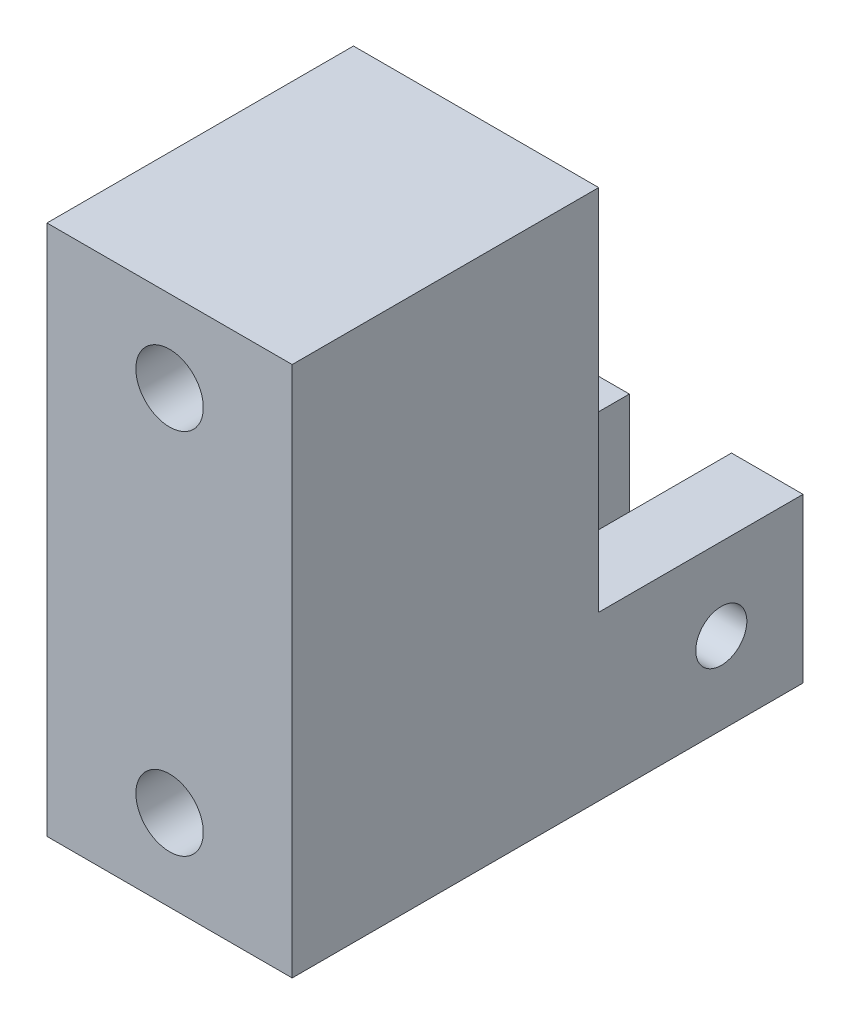
ISO-10303-21;
HEADER;
FILE_DESCRIPTION(('STEP AP214'),'2;1');
FILE_NAME('part.step','',(''),(''),'','','');
FILE_SCHEMA(('AUTOMOTIVE_DESIGN { 1 0 10303 214 1 1 1 1 }'));
ENDSEC;
DATA;
#1=APPLICATION_CONTEXT('core data for automotive mechanical design processes');
#2=APPLICATION_PROTOCOL_DEFINITION('international standard','automotive_design',2000,#1);
#3=PRODUCT_CONTEXT('',#1,'mechanical');
#4=PRODUCT('Part','Part','',(#3));
#5=PRODUCT_RELATED_PRODUCT_CATEGORY('part','',(#4));
#6=PRODUCT_DEFINITION_FORMATION('','',#4);
#7=PRODUCT_DEFINITION_CONTEXT('part definition',#1,'design');
#8=PRODUCT_DEFINITION('design','',#6,#7);
#9=PRODUCT_DEFINITION_SHAPE('','',#8);
#10=(LENGTH_UNIT() NAMED_UNIT(*) SI_UNIT(.MILLI.,.METRE.));
#11=(NAMED_UNIT(*) PLANE_ANGLE_UNIT() SI_UNIT($,.RADIAN.));
#12=(NAMED_UNIT(*) SI_UNIT($,.STERADIAN.) SOLID_ANGLE_UNIT());
#13=UNCERTAINTY_MEASURE_WITH_UNIT(LENGTH_MEASURE(1.E-05),#10,'distance_accuracy_value','');
#14=(GEOMETRIC_REPRESENTATION_CONTEXT(3) GLOBAL_UNCERTAINTY_ASSIGNED_CONTEXT((#13)) GLOBAL_UNIT_ASSIGNED_CONTEXT((#10,
#11,#12)) REPRESENTATION_CONTEXT('',''));
#15=CARTESIAN_POINT('',(0.,0.,0.));
#16=DIRECTION('',(0.,0.,1.));
#17=DIRECTION('',(1.,0.,0.));
#18=AXIS2_PLACEMENT_3D('',#15,#16,#17);
#19=CARTESIAN_POINT('',(6.,0.,0.));
#20=DIRECTION('',(-1.,0.,0.));
#21=DIRECTION('',(0.,0.,-1.));
#22=AXIS2_PLACEMENT_3D('',#19,#20,#21);
#23=PLANE('',#22);
#24=DIRECTION('',(0.,1.,0.));
#25=VECTOR('',#24,1.);
#26=CARTESIAN_POINT('',(6.,-13.,7.5));
#27=LINE('',#26,#25);
#28=CARTESIAN_POINT('',(6.,-13.,7.5));
#29=VERTEX_POINT('',#28);
#30=CARTESIAN_POINT('',(6.,13.,7.5));
#31=VERTEX_POINT('',#30);
#32=EDGE_CURVE('E158',#29,#31,#27,.T.);
#33=ORIENTED_EDGE('',*,*,#32,.F.);
#34=DIRECTION('',(0.,0.,1.));
#35=VECTOR('',#34,1.);
#36=CARTESIAN_POINT('',(6.,-13.,-7.5));
#37=LINE('',#36,#35);
#38=CARTESIAN_POINT('',(6.,-13.,-17.5));
#39=VERTEX_POINT('',#38);
#40=EDGE_CURVE('E138',#39,#29,#37,.T.);
#41=ORIENTED_EDGE('',*,*,#40,.F.);
#42=DIRECTION('',(0.,-1.,0.));
#43=VECTOR('',#42,1.);
#44=CARTESIAN_POINT('',(6.,-13.,-17.5));
#45=LINE('',#44,#43);
#46=CARTESIAN_POINT('',(6.,-5.,-17.5));
#47=VERTEX_POINT('',#46);
#48=EDGE_CURVE('E115',#47,#39,#45,.T.);
#49=ORIENTED_EDGE('',*,*,#48,.F.);
#50=DIRECTION('',(0.,0.,-1.));
#51=VECTOR('',#50,1.);
#52=CARTESIAN_POINT('',(6.,-5.,-7.5));
#53=LINE('',#52,#51);
#54=CARTESIAN_POINT('',(6.,-5.,-7.5));
#55=VERTEX_POINT('',#54);
#56=EDGE_CURVE('E127',#55,#47,#53,.T.);
#57=ORIENTED_EDGE('',*,*,#56,.F.);
#58=DIRECTION('',(0.,-1.,0.));
#59=VECTOR('',#58,1.);
#60=CARTESIAN_POINT('',(6.,-5.,-7.5));
#61=LINE('',#60,#59);
#62=CARTESIAN_POINT('',(6.,13.,-7.5));
#63=VERTEX_POINT('',#62);
#64=EDGE_CURVE('E134',#63,#55,#61,.T.);
#65=ORIENTED_EDGE('',*,*,#64,.F.);
#66=DIRECTION('',(0.,0.,-1.));
#67=VECTOR('',#66,1.);
#68=CARTESIAN_POINT('',(6.,13.,-7.5));
#69=LINE('',#68,#67);
#70=EDGE_CURVE('E165',#31,#63,#69,.T.);
#71=ORIENTED_EDGE('',*,*,#70,.F.);
#72=EDGE_LOOP('',(#33,#41,#49,#57,#65,#71));
#73=FACE_BOUND('',#72,.T.);
#74=CARTESIAN_POINT('',(6.,-9.,-13.5));
#75=DIRECTION('',(-1.,0.,0.));
#76=DIRECTION('',(0.,0.,1.));
#77=AXIS2_PLACEMENT_3D('',#74,#75,#76);
#78=CIRCLE('',#77,1.24999999999999);
#79=CARTESIAN_POINT('',(6.,-9.,-12.25));
#80=VERTEX_POINT('',#79);
#81=EDGE_CURVE('E218',#80,#80,#78,.T.);
#82=ORIENTED_EDGE('',*,*,#81,.T.);
#83=EDGE_LOOP('',(#82));
#84=FACE_BOUND('',#83,.T.);
#85=ADVANCED_FACE('F39',(#73,#84),#23,.F.);
#86=CARTESIAN_POINT('',(6.,-5.,-7.5));
#87=DIRECTION('',(0.,-1.,0.));
#88=DIRECTION('',(0.,0.,1.));
#89=AXIS2_PLACEMENT_3D('',#86,#87,#88);
#90=PLANE('',#89);
#91=DIRECTION('',(-1.,0.,0.));
#92=VECTOR('',#91,1.);
#93=CARTESIAN_POINT('',(6.,-5.,-7.5));
#94=LINE('',#93,#92);
#95=CARTESIAN_POINT('',(2.5,-5.,-7.5));
#96=VERTEX_POINT('',#95);
#97=EDGE_CURVE('E130',#55,#96,#94,.T.);
#98=ORIENTED_EDGE('',*,*,#97,.F.);
#99=ORIENTED_EDGE('',*,*,#56,.T.);
#100=DIRECTION('',(-1.,0.,0.));
#101=VECTOR('',#100,1.);
#102=CARTESIAN_POINT('',(6.,-5.,-17.5));
#103=LINE('',#102,#101);
#104=CARTESIAN_POINT('',(2.5,-5.,-17.5));
#105=VERTEX_POINT('',#104);
#106=EDGE_CURVE('E110',#47,#105,#103,.T.);
#107=ORIENTED_EDGE('',*,*,#106,.T.);
#108=DIRECTION('',(0.,0.,1.));
#109=VECTOR('',#108,1.);
#110=CARTESIAN_POINT('',(2.5,-5.,-17.5));
#111=LINE('',#110,#109);
#112=EDGE_CURVE('E196',#105,#96,#111,.T.);
#113=ORIENTED_EDGE('',*,*,#112,.T.);
#114=EDGE_LOOP('',(#98,#99,#107,#113));
#115=FACE_BOUND('',#114,.T.);
#116=ADVANCED_FACE('F128',(#115),#90,.F.);
#117=CARTESIAN_POINT('',(6.,-13.,-17.5));
#118=DIRECTION('',(0.,0.,1.));
#119=DIRECTION('',(0.,1.,0.));
#120=AXIS2_PLACEMENT_3D('',#117,#118,#119);
#121=PLANE('',#120);
#122=ORIENTED_EDGE('',*,*,#106,.F.);
#123=ORIENTED_EDGE('',*,*,#48,.T.);
#124=DIRECTION('',(-1.,0.,0.));
#125=VECTOR('',#124,1.);
#126=CARTESIAN_POINT('',(6.,-13.,-17.5));
#127=LINE('',#126,#125);
#128=CARTESIAN_POINT('',(2.5,-13.,-17.5));
#129=VERTEX_POINT('',#128);
#130=EDGE_CURVE('E161',#39,#129,#127,.T.);
#131=ORIENTED_EDGE('',*,*,#130,.T.);
#132=DIRECTION('',(0.,1.,0.));
#133=VECTOR('',#132,1.);
#134=CARTESIAN_POINT('',(2.5,-13.001,-17.5));
#135=LINE('',#134,#133);
#136=EDGE_CURVE('E119',#129,#105,#135,.T.);
#137=ORIENTED_EDGE('',*,*,#136,.T.);
#138=EDGE_LOOP('',(#122,#123,#131,#137));
#139=FACE_BOUND('',#138,.T.);
#140=ADVANCED_FACE('F112',(#139),#121,.F.);
#141=CARTESIAN_POINT('',(6.,-13.,7.5));
#142=DIRECTION('',(0.,0.,-1.));
#143=DIRECTION('',(1.,0.,0.));
#144=AXIS2_PLACEMENT_3D('',#141,#142,#143);
#145=PLANE('',#144);
#146=CARTESIAN_POINT('',(0.,9.,7.5));
#147=DIRECTION('',(0.,0.,-1.));
#148=DIRECTION('',(-1.,0.,0.));
#149=AXIS2_PLACEMENT_3D('',#146,#147,#148);
#150=CIRCLE('',#149,1.65);
#151=CARTESIAN_POINT('',(-1.65,9.,7.5));
#152=VERTEX_POINT('',#151);
#153=EDGE_CURVE('E236',#152,#152,#150,.T.);
#154=ORIENTED_EDGE('',*,*,#153,.T.);
#155=EDGE_LOOP('',(#154));
#156=FACE_BOUND('',#155,.T.);
#157=CARTESIAN_POINT('',(0.,-9.,7.5));
#158=DIRECTION('',(0.,0.,-1.));
#159=DIRECTION('',(-1.,0.,0.));
#160=AXIS2_PLACEMENT_3D('',#157,#158,#159);
#161=CIRCLE('',#160,1.65);
#162=CARTESIAN_POINT('',(-1.65,-9.,7.5));
#163=VERTEX_POINT('',#162);
#164=EDGE_CURVE('E230',#163,#163,#161,.T.);
#165=ORIENTED_EDGE('',*,*,#164,.T.);
#166=EDGE_LOOP('',(#165));
#167=FACE_BOUND('',#166,.T.);
#168=DIRECTION('',(0.,1.,0.));
#169=VECTOR('',#168,1.);
#170=CARTESIAN_POINT('',(-6.,-13.,7.5));
#171=LINE('',#170,#169);
#172=CARTESIAN_POINT('',(-6.,-13.,7.5));
#173=VERTEX_POINT('',#172);
#174=CARTESIAN_POINT('',(-6.,13.,7.5));
#175=VERTEX_POINT('',#174);
#176=EDGE_CURVE('E143',#173,#175,#171,.T.);
#177=ORIENTED_EDGE('',*,*,#176,.F.);
#178=DIRECTION('',(-1.,0.,0.));
#179=VECTOR('',#178,1.);
#180=CARTESIAN_POINT('',(6.,-13.,7.5));
#181=LINE('',#180,#179);
#182=EDGE_CURVE('E63',#29,#173,#181,.T.);
#183=ORIENTED_EDGE('',*,*,#182,.F.);
#184=ORIENTED_EDGE('',*,*,#32,.T.);
#185=DIRECTION('',(-1.,0.,0.));
#186=VECTOR('',#185,1.);
#187=CARTESIAN_POINT('',(6.,13.,7.5));
#188=LINE('',#187,#186);
#189=EDGE_CURVE('E11',#31,#175,#188,.T.);
#190=ORIENTED_EDGE('',*,*,#189,.T.);
#191=EDGE_LOOP('',(#177,#183,#184,#190));
#192=FACE_BOUND('',#191,.T.);
#193=ADVANCED_FACE('F41',(#156,#167,#192),#145,.F.);
#194=CARTESIAN_POINT('',(6.,13.,-7.5));
#195=DIRECTION('',(0.,-1.,0.));
#196=DIRECTION('',(0.,0.,1.));
#197=AXIS2_PLACEMENT_3D('',#194,#195,#196);
#198=PLANE('',#197);
#199=DIRECTION('',(0.,0.,-1.));
#200=VECTOR('',#199,1.);
#201=CARTESIAN_POINT('',(-6.,13.,-7.5));
#202=LINE('',#201,#200);
#203=CARTESIAN_POINT('',(-6.,13.,-7.5));
#204=VERTEX_POINT('',#203);
#205=EDGE_CURVE('E145',#175,#204,#202,.T.);
#206=ORIENTED_EDGE('',*,*,#205,.F.);
#207=ORIENTED_EDGE('',*,*,#189,.F.);
#208=ORIENTED_EDGE('',*,*,#70,.T.);
#209=DIRECTION('',(-1.,0.,0.));
#210=VECTOR('',#209,1.);
#211=CARTESIAN_POINT('',(6.,13.,-7.5));
#212=LINE('',#211,#210);
#213=EDGE_CURVE('E47',#63,#204,#212,.T.);
#214=ORIENTED_EDGE('',*,*,#213,.T.);
#215=EDGE_LOOP('',(#206,#207,#208,#214));
#216=FACE_BOUND('',#215,.T.);
#217=ADVANCED_FACE('F164',(#216),#198,.F.);
#218=CARTESIAN_POINT('',(6.,-5.,-7.5));
#219=DIRECTION('',(0.,0.,1.));
#220=DIRECTION('',(-1.,0.,0.));
#221=AXIS2_PLACEMENT_3D('',#218,#219,#220);
#222=PLANE('',#221);
#223=CARTESIAN_POINT('',(0.,9.,-7.5));
#224=DIRECTION('',(0.,0.,-1.));
#225=DIRECTION('',(-1.,0.,0.));
#226=AXIS2_PLACEMENT_3D('',#223,#224,#225);
#227=CIRCLE('',#226,1.65);
#228=CARTESIAN_POINT('',(-1.65,9.,-7.5));
#229=VERTEX_POINT('',#228);
#230=EDGE_CURVE('E233',#229,#229,#227,.T.);
#231=ORIENTED_EDGE('',*,*,#230,.F.);
#232=EDGE_LOOP('',(#231));
#233=FACE_BOUND('',#232,.T.);
#234=CARTESIAN_POINT('',(0.,-9.,-7.5));
#235=DIRECTION('',(0.,0.,-1.));
#236=DIRECTION('',(-1.,0.,0.));
#237=AXIS2_PLACEMENT_3D('',#234,#235,#236);
#238=CIRCLE('',#237,1.65);
#239=CARTESIAN_POINT('',(-1.65,-9.,-7.5));
#240=VERTEX_POINT('',#239);
#241=EDGE_CURVE('E227',#240,#240,#238,.T.);
#242=ORIENTED_EDGE('',*,*,#241,.F.);
#243=EDGE_LOOP('',(#242));
#244=FACE_BOUND('',#243,.T.);
#245=DIRECTION('',(0.,-1.,0.));
#246=VECTOR('',#245,1.);
#247=CARTESIAN_POINT('',(-6.,-5.,-7.5));
#248=LINE('',#247,#246);
#249=CARTESIAN_POINT('',(-6.,-5.,-7.5));
#250=VERTEX_POINT('',#249);
#251=EDGE_CURVE('E149',#204,#250,#248,.T.);
#252=ORIENTED_EDGE('',*,*,#251,.F.);
#253=ORIENTED_EDGE('',*,*,#213,.F.);
#254=ORIENTED_EDGE('',*,*,#64,.T.);
#255=ORIENTED_EDGE('',*,*,#97,.T.);
#256=DIRECTION('',(0.,1.,0.));
#257=VECTOR('',#256,1.);
#258=CARTESIAN_POINT('',(2.5,-13.001,-7.49999999999999));
#259=LINE('',#258,#257);
#260=CARTESIAN_POINT('',(2.5,-13.,-7.49999999999999));
#261=VERTEX_POINT('',#260);
#262=EDGE_CURVE('E178',#261,#96,#259,.T.);
#263=ORIENTED_EDGE('',*,*,#262,.F.);
#264=DIRECTION('',(1.,0.,0.));
#265=VECTOR('',#264,1.);
#266=CARTESIAN_POINT('',(-2.5,-13.,-7.49999999999999));
#267=LINE('',#266,#265);
#268=CARTESIAN_POINT('',(-2.5,-13.,-7.49999999999999));
#269=VERTEX_POINT('',#268);
#270=EDGE_CURVE('E146',#269,#261,#267,.T.);
#271=ORIENTED_EDGE('',*,*,#270,.F.);
#272=DIRECTION('',(0.,1.,0.));
#273=VECTOR('',#272,1.);
#274=CARTESIAN_POINT('',(-2.5,-13.001,-7.49999999999999));
#275=LINE('',#274,#273);
#276=CARTESIAN_POINT('',(-2.5,-5.,-7.5));
#277=VERTEX_POINT('',#276);
#278=EDGE_CURVE('E201',#269,#277,#275,.T.);
#279=ORIENTED_EDGE('',*,*,#278,.T.);
#280=EDGE_CURVE('E123',#277,#250,#94,.T.);
#281=ORIENTED_EDGE('',*,*,#280,.T.);
#282=EDGE_LOOP('',(#252,#253,#254,#255,#263,#271,#279,#281));
#283=FACE_BOUND('',#282,.T.);
#284=ADVANCED_FACE('F172',(#233,#244,#283),#222,.F.);
#285=CARTESIAN_POINT('',(-2.5,-5.,-17.5));
#286=VERTEX_POINT('',#285);
#287=CARTESIAN_POINT('',(-6.,-5.,-17.5));
#288=VERTEX_POINT('',#287);
#289=EDGE_CURVE('E124',#286,#288,#103,.T.);
#290=ORIENTED_EDGE('',*,*,#289,.T.);
#291=DIRECTION('',(0.,0.,-1.));
#292=VECTOR('',#291,1.);
#293=CARTESIAN_POINT('',(-6.,-5.,-7.5));
#294=LINE('',#293,#292);
#295=EDGE_CURVE('E152',#250,#288,#294,.T.);
#296=ORIENTED_EDGE('',*,*,#295,.F.);
#297=ORIENTED_EDGE('',*,*,#280,.F.);
#298=DIRECTION('',(0.,0.,-1.));
#299=VECTOR('',#298,1.);
#300=CARTESIAN_POINT('',(-2.5,-5.,-17.5));
#301=LINE('',#300,#299);
#302=EDGE_CURVE('E204',#277,#286,#301,.T.);
#303=ORIENTED_EDGE('',*,*,#302,.T.);
#304=EDGE_LOOP('',(#290,#296,#297,#303));
#305=FACE_BOUND('',#304,.T.);
#306=ADVANCED_FACE('F259',(#305),#90,.F.);
#307=CARTESIAN_POINT('',(-2.5,-13.,-17.5));
#308=VERTEX_POINT('',#307);
#309=CARTESIAN_POINT('',(-6.,-13.,-17.5));
#310=VERTEX_POINT('',#309);
#311=EDGE_CURVE('E160',#308,#310,#127,.T.);
#312=ORIENTED_EDGE('',*,*,#311,.T.);
#313=DIRECTION('',(0.,-1.,0.));
#314=VECTOR('',#313,1.);
#315=CARTESIAN_POINT('',(-6.,-13.,-17.5));
#316=LINE('',#315,#314);
#317=EDGE_CURVE('E155',#288,#310,#316,.T.);
#318=ORIENTED_EDGE('',*,*,#317,.F.);
#319=ORIENTED_EDGE('',*,*,#289,.F.);
#320=DIRECTION('',(0.,1.,0.));
#321=VECTOR('',#320,1.);
#322=CARTESIAN_POINT('',(-2.5,-13.001,-17.5));
#323=LINE('',#322,#321);
#324=EDGE_CURVE('E199',#308,#286,#323,.T.);
#325=ORIENTED_EDGE('',*,*,#324,.F.);
#326=EDGE_LOOP('',(#312,#318,#319,#325));
#327=FACE_BOUND('',#326,.T.);
#328=ADVANCED_FACE('F268',(#327),#121,.F.);
#329=CARTESIAN_POINT('',(6.,-13.,-7.5));
#330=DIRECTION('',(0.,1.,0.));
#331=DIRECTION('',(0.,0.,-1.));
#332=AXIS2_PLACEMENT_3D('',#329,#330,#331);
#333=PLANE('',#332);
#334=ORIENTED_EDGE('',*,*,#130,.F.);
#335=ORIENTED_EDGE('',*,*,#40,.T.);
#336=ORIENTED_EDGE('',*,*,#182,.T.);
#337=DIRECTION('',(0.,0.,1.));
#338=VECTOR('',#337,1.);
#339=CARTESIAN_POINT('',(-6.,-13.,-7.5));
#340=LINE('',#339,#338);
#341=EDGE_CURVE('E91',#310,#173,#340,.T.);
#342=ORIENTED_EDGE('',*,*,#341,.F.);
#343=ORIENTED_EDGE('',*,*,#311,.F.);
#344=DIRECTION('',(0.,0.,1.));
#345=VECTOR('',#344,1.);
#346=CARTESIAN_POINT('',(-2.5,-13.,-17.5));
#347=LINE('',#346,#345);
#348=EDGE_CURVE('E54',#308,#269,#347,.T.);
#349=ORIENTED_EDGE('',*,*,#348,.T.);
#350=ORIENTED_EDGE('',*,*,#270,.T.);
#351=DIRECTION('',(0.,0.,-1.));
#352=VECTOR('',#351,1.);
#353=CARTESIAN_POINT('',(2.5,-13.,-17.5));
#354=LINE('',#353,#352);
#355=EDGE_CURVE('E194',#261,#129,#354,.T.);
#356=ORIENTED_EDGE('',*,*,#355,.T.);
#357=EDGE_LOOP('',(#334,#335,#336,#342,#343,#349,#350,#356));
#358=FACE_BOUND('',#357,.T.);
#359=ADVANCED_FACE('F195',(#358),#333,.F.);
#360=CARTESIAN_POINT('',(-6.,0.,0.));
#361=DIRECTION('',(-1.,0.,0.));
#362=DIRECTION('',(0.,0.,-1.));
#363=AXIS2_PLACEMENT_3D('',#360,#361,#362);
#364=PLANE('',#363);
#365=CARTESIAN_POINT('',(-6.,-9.,-13.5));
#366=DIRECTION('',(1.,0.,0.));
#367=DIRECTION('',(0.,0.,-1.));
#368=AXIS2_PLACEMENT_3D('',#365,#366,#367);
#369=CIRCLE('',#368,1.6);
#370=CARTESIAN_POINT('',(-6.,-9.,-15.1));
#371=VERTEX_POINT('',#370);
#372=EDGE_CURVE('E224',#371,#371,#369,.T.);
#373=ORIENTED_EDGE('',*,*,#372,.T.);
#374=EDGE_LOOP('',(#373));
#375=FACE_BOUND('',#374,.T.);
#376=ORIENTED_EDGE('',*,*,#176,.T.);
#377=ORIENTED_EDGE('',*,*,#205,.T.);
#378=ORIENTED_EDGE('',*,*,#251,.T.);
#379=ORIENTED_EDGE('',*,*,#295,.T.);
#380=ORIENTED_EDGE('',*,*,#317,.T.);
#381=ORIENTED_EDGE('',*,*,#341,.T.);
#382=EDGE_LOOP('',(#376,#377,#378,#379,#380,#381));
#383=FACE_BOUND('',#382,.T.);
#384=ADVANCED_FACE('F167',(#375,#383),#364,.T.);
#385=CARTESIAN_POINT('',(2.5,-13.001,-17.5));
#386=DIRECTION('',(1.,0.,0.));
#387=DIRECTION('',(0.,0.,1.));
#388=AXIS2_PLACEMENT_3D('',#385,#386,#387);
#389=PLANE('',#388);
#390=CARTESIAN_POINT('',(2.5,-9.,-13.5));
#391=DIRECTION('',(-1.,0.,0.));
#392=DIRECTION('',(0.,0.,1.));
#393=AXIS2_PLACEMENT_3D('',#390,#391,#392);
#394=CIRCLE('',#393,1.24999999999999);
#395=CARTESIAN_POINT('',(2.5,-9.,-12.25));
#396=VERTEX_POINT('',#395);
#397=EDGE_CURVE('E215',#396,#396,#394,.T.);
#398=ORIENTED_EDGE('',*,*,#397,.F.);
#399=EDGE_LOOP('',(#398));
#400=FACE_BOUND('',#399,.T.);
#401=ORIENTED_EDGE('',*,*,#355,.F.);
#402=ORIENTED_EDGE('',*,*,#262,.T.);
#403=ORIENTED_EDGE('',*,*,#112,.F.);
#404=ORIENTED_EDGE('',*,*,#136,.F.);
#405=EDGE_LOOP('',(#401,#402,#403,#404));
#406=FACE_BOUND('',#405,.T.);
#407=ADVANCED_FACE('F198',(#400,#406),#389,.F.);
#408=CARTESIAN_POINT('',(-2.5,-13.001,-17.5));
#409=DIRECTION('',(-1.,0.,0.));
#410=DIRECTION('',(0.,0.,-1.));
#411=AXIS2_PLACEMENT_3D('',#408,#409,#410);
#412=PLANE('',#411);
#413=CARTESIAN_POINT('',(-2.5,-9.,-13.5));
#414=DIRECTION('',(1.,0.,0.));
#415=DIRECTION('',(0.,0.,-1.));
#416=AXIS2_PLACEMENT_3D('',#413,#414,#415);
#417=CIRCLE('',#416,1.6);
#418=CARTESIAN_POINT('',(-2.5,-9.,-15.1));
#419=VERTEX_POINT('',#418);
#420=EDGE_CURVE('E221',#419,#419,#417,.T.);
#421=ORIENTED_EDGE('',*,*,#420,.F.);
#422=EDGE_LOOP('',(#421));
#423=FACE_BOUND('',#422,.T.);
#424=ORIENTED_EDGE('',*,*,#348,.F.);
#425=ORIENTED_EDGE('',*,*,#324,.T.);
#426=ORIENTED_EDGE('',*,*,#302,.F.);
#427=ORIENTED_EDGE('',*,*,#278,.F.);
#428=EDGE_LOOP('',(#424,#425,#426,#427));
#429=FACE_BOUND('',#428,.T.);
#430=ADVANCED_FACE('F343',(#423,#429),#412,.F.);
#431=CARTESIAN_POINT('',(6.,-9.,-13.5));
#432=DIRECTION('',(1.,0.,0.));
#433=DIRECTION('',(0.,0.,1.));
#434=AXIS2_PLACEMENT_3D('',#431,#432,#433);
#435=CYLINDRICAL_SURFACE('',#434,1.24999999999999);
#436=ORIENTED_EDGE('',*,*,#397,.T.);
#437=EDGE_LOOP('',(#436));
#438=FACE_BOUND('',#437,.T.);
#439=ORIENTED_EDGE('',*,*,#81,.F.);
#440=EDGE_LOOP('',(#439));
#441=FACE_BOUND('',#440,.T.);
#442=ADVANCED_FACE('F351',(#438,#441),#435,.F.);
#443=CARTESIAN_POINT('',(-6.,-9.,-13.5));
#444=DIRECTION('',(-1.,0.,0.));
#445=DIRECTION('',(0.,0.,-1.));
#446=AXIS2_PLACEMENT_3D('',#443,#444,#445);
#447=CYLINDRICAL_SURFACE('',#446,1.6);
#448=ORIENTED_EDGE('',*,*,#420,.T.);
#449=EDGE_LOOP('',(#448));
#450=FACE_BOUND('',#449,.T.);
#451=ORIENTED_EDGE('',*,*,#372,.F.);
#452=EDGE_LOOP('',(#451));
#453=FACE_BOUND('',#452,.T.);
#454=ADVANCED_FACE('F250',(#450,#453),#447,.F.);
#455=CARTESIAN_POINT('',(0.,-9.,7.5));
#456=DIRECTION('',(0.,0.,1.));
#457=DIRECTION('',(-1.,0.,0.));
#458=AXIS2_PLACEMENT_3D('',#455,#456,#457);
#459=CYLINDRICAL_SURFACE('',#458,1.65);
#460=ORIENTED_EDGE('',*,*,#241,.T.);
#461=EDGE_LOOP('',(#460));
#462=FACE_BOUND('',#461,.T.);
#463=ORIENTED_EDGE('',*,*,#164,.F.);
#464=EDGE_LOOP('',(#463));
#465=FACE_BOUND('',#464,.T.);
#466=ADVANCED_FACE('F244',(#462,#465),#459,.F.);
#467=CARTESIAN_POINT('',(0.,9.,7.5));
#468=DIRECTION('',(0.,0.,1.));
#469=DIRECTION('',(-1.,0.,0.));
#470=AXIS2_PLACEMENT_3D('',#467,#468,#469);
#471=CYLINDRICAL_SURFACE('',#470,1.65);
#472=ORIENTED_EDGE('',*,*,#230,.T.);
#473=EDGE_LOOP('',(#472));
#474=FACE_BOUND('',#473,.T.);
#475=ORIENTED_EDGE('',*,*,#153,.F.);
#476=EDGE_LOOP('',(#475));
#477=FACE_BOUND('',#476,.T.);
#478=ADVANCED_FACE('F242',(#474,#477),#471,.F.);
#479=CLOSED_SHELL('',(#85,#116,#140,#193,#217,#284,#306,#328,#359,#384,#407,#430,#442,#454,#466,#478));
#480=MANIFOLD_SOLID_BREP('B2',#479);
#481=ADVANCED_BREP_SHAPE_REPRESENTATION('',(#18,#480),#14);
#482=SHAPE_DEFINITION_REPRESENTATION(#9,#481);
ENDSEC;
END-ISO-10303-21;
